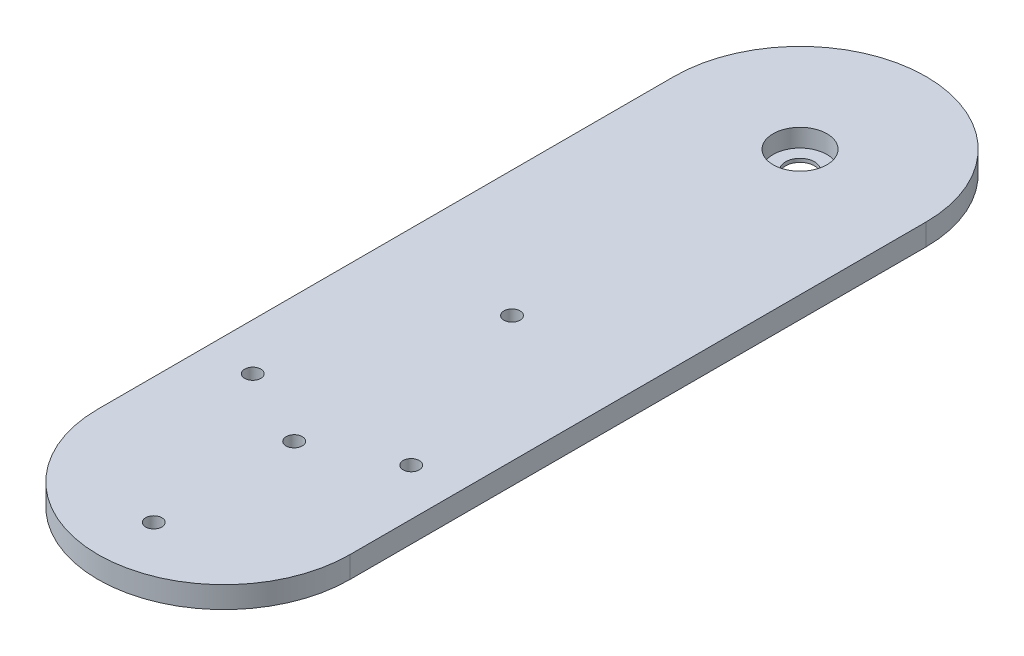
ISO-10303-21;
HEADER;
FILE_DESCRIPTION(('STEP AP214'),'2;1');
FILE_NAME('part.step','',(''),(''),'','','');
FILE_SCHEMA(('AUTOMOTIVE_DESIGN { 1 0 10303 214 1 1 1 1 }'));
ENDSEC;
DATA;
#1=APPLICATION_CONTEXT('core data for automotive mechanical design processes');
#2=APPLICATION_PROTOCOL_DEFINITION('international standard','automotive_design',2000,#1);
#3=PRODUCT_CONTEXT('',#1,'mechanical');
#4=PRODUCT('Part','Part','',(#3));
#5=PRODUCT_RELATED_PRODUCT_CATEGORY('part','',(#4));
#6=PRODUCT_DEFINITION_FORMATION('','',#4);
#7=PRODUCT_DEFINITION_CONTEXT('part definition',#1,'design');
#8=PRODUCT_DEFINITION('design','',#6,#7);
#9=PRODUCT_DEFINITION_SHAPE('','',#8);
#10=(LENGTH_UNIT() NAMED_UNIT(*) SI_UNIT(.MILLI.,.METRE.));
#11=(NAMED_UNIT(*) PLANE_ANGLE_UNIT() SI_UNIT($,.RADIAN.));
#12=(NAMED_UNIT(*) SI_UNIT($,.STERADIAN.) SOLID_ANGLE_UNIT());
#13=UNCERTAINTY_MEASURE_WITH_UNIT(LENGTH_MEASURE(1.E-05),#10,'distance_accuracy_value','');
#14=(GEOMETRIC_REPRESENTATION_CONTEXT(3) GLOBAL_UNCERTAINTY_ASSIGNED_CONTEXT((#13)) GLOBAL_UNIT_ASSIGNED_CONTEXT((#10,
#11,#12)) REPRESENTATION_CONTEXT('',''));
#15=CARTESIAN_POINT('',(0.,0.,0.));
#16=DIRECTION('',(0.,0.,1.));
#17=DIRECTION('',(1.,0.,0.));
#18=AXIS2_PLACEMENT_3D('',#15,#16,#17);
#19=CARTESIAN_POINT('',(35.,-46.75,330.));
#20=DIRECTION('',(-1.,0.,0.));
#21=DIRECTION('',(0.,0.,1.));
#22=AXIS2_PLACEMENT_3D('',#19,#20,#21);
#23=PLANE('',#22);
#24=DIRECTION('',(0.,0.,-1.));
#25=VECTOR('',#24,1.);
#26=CARTESIAN_POINT('',(35.,-52.75,330.));
#27=LINE('',#26,#25);
#28=CARTESIAN_POINT('',(35.,-52.75,330.));
#29=VERTEX_POINT('',#28);
#30=CARTESIAN_POINT('',(35.,-52.75,170.));
#31=VERTEX_POINT('',#30);
#32=EDGE_CURVE('E91',#29,#31,#27,.T.);
#33=ORIENTED_EDGE('',*,*,#32,.T.);
#34=DIRECTION('',(0.,-1.,0.));
#35=VECTOR('',#34,1.);
#36=CARTESIAN_POINT('',(35.,-46.75,170.));
#37=LINE('',#36,#35);
#38=CARTESIAN_POINT('',(35.,-46.75,170.));
#39=VERTEX_POINT('',#38);
#40=EDGE_CURVE('E11',#39,#31,#37,.T.);
#41=ORIENTED_EDGE('',*,*,#40,.F.);
#42=DIRECTION('',(0.,0.,-1.));
#43=VECTOR('',#42,1.);
#44=CARTESIAN_POINT('',(35.,-46.75,330.));
#45=LINE('',#44,#43);
#46=CARTESIAN_POINT('',(35.,-46.75,330.));
#47=VERTEX_POINT('',#46);
#48=EDGE_CURVE('E58',#47,#39,#45,.T.);
#49=ORIENTED_EDGE('',*,*,#48,.F.);
#50=DIRECTION('',(0.,-1.,0.));
#51=VECTOR('',#50,1.);
#52=CARTESIAN_POINT('',(35.,-46.75,330.));
#53=LINE('',#52,#51);
#54=EDGE_CURVE('E105',#47,#29,#53,.T.);
#55=ORIENTED_EDGE('',*,*,#54,.T.);
#56=EDGE_LOOP('',(#33,#41,#49,#55));
#57=FACE_BOUND('',#56,.T.);
#58=ADVANCED_FACE('F43',(#57),#23,.F.);
#59=CARTESIAN_POINT('',(-35.,-46.75,330.));
#60=DIRECTION('',(1.,0.,0.));
#61=DIRECTION('',(0.,0.,-1.));
#62=AXIS2_PLACEMENT_3D('',#59,#60,#61);
#63=PLANE('',#62);
#64=DIRECTION('',(0.,0.,1.));
#65=VECTOR('',#64,1.);
#66=CARTESIAN_POINT('',(-35.,-52.75,330.));
#67=LINE('',#66,#65);
#68=CARTESIAN_POINT('',(-35.,-52.75,170.));
#69=VERTEX_POINT('',#68);
#70=CARTESIAN_POINT('',(-35.,-52.75,330.));
#71=VERTEX_POINT('',#70);
#72=EDGE_CURVE('E83',#69,#71,#67,.T.);
#73=ORIENTED_EDGE('',*,*,#72,.T.);
#74=DIRECTION('',(0.,-1.,0.));
#75=VECTOR('',#74,1.);
#76=CARTESIAN_POINT('',(-35.,-46.75,330.));
#77=LINE('',#76,#75);
#78=CARTESIAN_POINT('',(-35.,-46.75,330.));
#79=VERTEX_POINT('',#78);
#80=EDGE_CURVE('E86',#79,#71,#77,.T.);
#81=ORIENTED_EDGE('',*,*,#80,.F.);
#82=DIRECTION('',(0.,0.,1.));
#83=VECTOR('',#82,1.);
#84=CARTESIAN_POINT('',(-35.,-46.75,330.));
#85=LINE('',#84,#83);
#86=CARTESIAN_POINT('',(-35.,-46.75,170.));
#87=VERTEX_POINT('',#86);
#88=EDGE_CURVE('E120',#87,#79,#85,.T.);
#89=ORIENTED_EDGE('',*,*,#88,.F.);
#90=DIRECTION('',(0.,-1.,0.));
#91=VECTOR('',#90,1.);
#92=CARTESIAN_POINT('',(-35.,-46.75,170.));
#93=LINE('',#92,#91);
#94=EDGE_CURVE('E55',#87,#69,#93,.T.);
#95=ORIENTED_EDGE('',*,*,#94,.T.);
#96=EDGE_LOOP('',(#73,#81,#89,#95));
#97=FACE_BOUND('',#96,.T.);
#98=ADVANCED_FACE('F88',(#97),#63,.F.);
#99=CARTESIAN_POINT('',(0.,-46.75,0.));
#100=DIRECTION('',(0.,-1.,0.));
#101=DIRECTION('',(0.,0.,-1.));
#102=AXIS2_PLACEMENT_3D('',#99,#100,#101);
#103=PLANE('',#102);
#104=CARTESIAN_POINT('',(0.,-46.75,310.5));
#105=DIRECTION('',(0.,1.,0.));
#106=DIRECTION('',(0.,0.,1.));
#107=AXIS2_PLACEMENT_3D('',#104,#105,#106);
#108=CIRCLE('',#107,2.25);
#109=CARTESIAN_POINT('',(0.,-46.75,312.75));
#110=VERTEX_POINT('',#109);
#111=EDGE_CURVE('E135',#110,#110,#108,.T.);
#112=ORIENTED_EDGE('',*,*,#111,.F.);
#113=EDGE_LOOP('',(#112));
#114=FACE_BOUND('',#113,.T.);
#115=CARTESIAN_POINT('',(0.,-46.75,349.5));
#116=DIRECTION('',(0.,1.,0.));
#117=DIRECTION('',(0.,0.,1.));
#118=AXIS2_PLACEMENT_3D('',#115,#116,#117);
#119=CIRCLE('',#118,2.25);
#120=CARTESIAN_POINT('',(0.,-46.75,351.75));
#121=VERTEX_POINT('',#120);
#122=EDGE_CURVE('E248',#121,#121,#119,.T.);
#123=ORIENTED_EDGE('',*,*,#122,.F.);
#124=EDGE_LOOP('',(#123));
#125=FACE_BOUND('',#124,.T.);
#126=CARTESIAN_POINT('',(0.,-46.75,170.));
#127=DIRECTION('',(0.,1.,0.));
#128=DIRECTION('',(0.,0.,1.));
#129=AXIS2_PLACEMENT_3D('',#126,#127,#128);
#130=CIRCLE('',#129,7.475);
#131=CARTESIAN_POINT('',(0.,-46.75,177.475));
#132=VERTEX_POINT('',#131);
#133=EDGE_CURVE('E141',#132,#132,#130,.T.);
#134=ORIENTED_EDGE('',*,*,#133,.F.);
#135=EDGE_LOOP('',(#134));
#136=FACE_BOUND('',#135,.T.);
#137=CARTESIAN_POINT('',(0.,-46.75,250.));
#138=DIRECTION('',(0.,1.,0.));
#139=DIRECTION('',(0.,0.,1.));
#140=AXIS2_PLACEMENT_3D('',#137,#138,#139);
#141=CIRCLE('',#140,2.25);
#142=CARTESIAN_POINT('',(0.,-46.75,252.25));
#143=VERTEX_POINT('',#142);
#144=EDGE_CURVE('E111',#143,#143,#141,.T.);
#145=ORIENTED_EDGE('',*,*,#144,.F.);
#146=EDGE_LOOP('',(#145));
#147=FACE_BOUND('',#146,.T.);
#148=CARTESIAN_POINT('',(-22.,-46.75,300.));
#149=DIRECTION('',(0.,1.,0.));
#150=DIRECTION('',(0.,0.,1.));
#151=AXIS2_PLACEMENT_3D('',#148,#149,#150);
#152=CIRCLE('',#151,2.25);
#153=CARTESIAN_POINT('',(-22.,-46.75,302.25));
#154=VERTEX_POINT('',#153);
#155=EDGE_CURVE('E166',#154,#154,#152,.T.);
#156=ORIENTED_EDGE('',*,*,#155,.F.);
#157=EDGE_LOOP('',(#156));
#158=FACE_BOUND('',#157,.T.);
#159=CARTESIAN_POINT('',(22.,-46.75,300.));
#160=DIRECTION('',(0.,1.,0.));
#161=DIRECTION('',(0.,0.,1.));
#162=AXIS2_PLACEMENT_3D('',#159,#160,#161);
#163=CIRCLE('',#162,2.25);
#164=CARTESIAN_POINT('',(22.,-46.75,302.25));
#165=VERTEX_POINT('',#164);
#166=EDGE_CURVE('E138',#165,#165,#163,.T.);
#167=ORIENTED_EDGE('',*,*,#166,.F.);
#168=EDGE_LOOP('',(#167));
#169=FACE_BOUND('',#168,.T.);
#170=ORIENTED_EDGE('',*,*,#48,.T.);
#171=CARTESIAN_POINT('',(0.,-46.75,170.));
#172=DIRECTION('',(0.,1.,0.));
#173=DIRECTION('',(0.,0.,1.));
#174=AXIS2_PLACEMENT_3D('',#171,#172,#173);
#175=CIRCLE('',#174,35.);
#176=EDGE_CURVE('E115',#39,#87,#175,.T.);
#177=ORIENTED_EDGE('',*,*,#176,.T.);
#178=ORIENTED_EDGE('',*,*,#88,.T.);
#179=CARTESIAN_POINT('',(0.,-46.75,330.));
#180=DIRECTION('',(0.,1.,0.));
#181=DIRECTION('',(0.,0.,1.));
#182=AXIS2_PLACEMENT_3D('',#179,#180,#181);
#183=CIRCLE('',#182,35.);
#184=EDGE_CURVE('E99',#79,#47,#183,.T.);
#185=ORIENTED_EDGE('',*,*,#184,.T.);
#186=EDGE_LOOP('',(#170,#177,#178,#185));
#187=FACE_BOUND('',#186,.T.);
#188=ADVANCED_FACE('F180',(#114,#125,#136,#147,#158,#169,#187),#103,.F.);
#189=CARTESIAN_POINT('',(0.,-52.75,0.));
#190=DIRECTION('',(0.,-1.,0.));
#191=DIRECTION('',(0.,0.,-1.));
#192=AXIS2_PLACEMENT_3D('',#189,#190,#191);
#193=PLANE('',#192);
#194=CARTESIAN_POINT('',(0.,-52.75,310.5));
#195=DIRECTION('',(0.,1.,0.));
#196=DIRECTION('',(0.,0.,1.));
#197=AXIS2_PLACEMENT_3D('',#194,#195,#196);
#198=CIRCLE('',#197,2.25);
#199=CARTESIAN_POINT('',(0.,-52.75,312.75));
#200=VERTEX_POINT('',#199);
#201=EDGE_CURVE('E136',#200,#200,#198,.T.);
#202=ORIENTED_EDGE('',*,*,#201,.T.);
#203=EDGE_LOOP('',(#202));
#204=FACE_BOUND('',#203,.T.);
#205=CARTESIAN_POINT('',(0.,-52.75,349.5));
#206=DIRECTION('',(0.,1.,0.));
#207=DIRECTION('',(0.,0.,1.));
#208=AXIS2_PLACEMENT_3D('',#205,#206,#207);
#209=CIRCLE('',#208,2.25);
#210=CARTESIAN_POINT('',(0.,-52.75,351.75));
#211=VERTEX_POINT('',#210);
#212=EDGE_CURVE('E155',#211,#211,#209,.T.);
#213=ORIENTED_EDGE('',*,*,#212,.T.);
#214=EDGE_LOOP('',(#213));
#215=FACE_BOUND('',#214,.T.);
#216=CARTESIAN_POINT('',(0.,-52.75,170.));
#217=DIRECTION('',(0.,1.,0.));
#218=DIRECTION('',(0.,0.,1.));
#219=AXIS2_PLACEMENT_3D('',#216,#217,#218);
#220=CIRCLE('',#219,4.);
#221=CARTESIAN_POINT('',(0.,-52.75,174.));
#222=VERTEX_POINT('',#221);
#223=EDGE_CURVE('E134',#222,#222,#220,.T.);
#224=ORIENTED_EDGE('',*,*,#223,.T.);
#225=EDGE_LOOP('',(#224));
#226=FACE_BOUND('',#225,.T.);
#227=CARTESIAN_POINT('',(0.,-52.75,250.));
#228=DIRECTION('',(0.,1.,0.));
#229=DIRECTION('',(0.,0.,1.));
#230=AXIS2_PLACEMENT_3D('',#227,#228,#229);
#231=CIRCLE('',#230,2.25);
#232=CARTESIAN_POINT('',(0.,-52.75,252.25));
#233=VERTEX_POINT('',#232);
#234=EDGE_CURVE('E144',#233,#233,#231,.T.);
#235=ORIENTED_EDGE('',*,*,#234,.T.);
#236=EDGE_LOOP('',(#235));
#237=FACE_BOUND('',#236,.T.);
#238=CARTESIAN_POINT('',(-22.,-52.75,300.));
#239=DIRECTION('',(0.,1.,0.));
#240=DIRECTION('',(0.,0.,1.));
#241=AXIS2_PLACEMENT_3D('',#238,#239,#240);
#242=CIRCLE('',#241,2.25);
#243=CARTESIAN_POINT('',(-22.,-52.75,302.25));
#244=VERTEX_POINT('',#243);
#245=EDGE_CURVE('E146',#244,#244,#242,.T.);
#246=ORIENTED_EDGE('',*,*,#245,.T.);
#247=EDGE_LOOP('',(#246));
#248=FACE_BOUND('',#247,.T.);
#249=CARTESIAN_POINT('',(22.,-52.75,300.));
#250=DIRECTION('',(0.,1.,0.));
#251=DIRECTION('',(0.,0.,1.));
#252=AXIS2_PLACEMENT_3D('',#249,#250,#251);
#253=CIRCLE('',#252,2.25);
#254=CARTESIAN_POINT('',(22.,-52.75,302.25));
#255=VERTEX_POINT('',#254);
#256=EDGE_CURVE('E142',#255,#255,#253,.T.);
#257=ORIENTED_EDGE('',*,*,#256,.T.);
#258=EDGE_LOOP('',(#257));
#259=FACE_BOUND('',#258,.T.);
#260=ORIENTED_EDGE('',*,*,#72,.F.);
#261=CARTESIAN_POINT('',(0.,-52.75,170.));
#262=DIRECTION('',(0.,1.,0.));
#263=DIRECTION('',(0.,0.,1.));
#264=AXIS2_PLACEMENT_3D('',#261,#262,#263);
#265=CIRCLE('',#264,35.);
#266=EDGE_CURVE('E72',#31,#69,#265,.T.);
#267=ORIENTED_EDGE('',*,*,#266,.F.);
#268=ORIENTED_EDGE('',*,*,#32,.F.);
#269=CARTESIAN_POINT('',(0.,-52.75,330.));
#270=DIRECTION('',(0.,1.,0.));
#271=DIRECTION('',(0.,0.,1.));
#272=AXIS2_PLACEMENT_3D('',#269,#270,#271);
#273=CIRCLE('',#272,35.);
#274=EDGE_CURVE('E98',#71,#29,#273,.T.);
#275=ORIENTED_EDGE('',*,*,#274,.F.);
#276=EDGE_LOOP('',(#260,#267,#268,#275));
#277=FACE_BOUND('',#276,.T.);
#278=ADVANCED_FACE('F104',(#204,#215,#226,#237,#248,#259,#277),#193,.T.);
#279=CARTESIAN_POINT('',(0.,-46.75,330.));
#280=DIRECTION('',(0.,-1.,0.));
#281=DIRECTION('',(0.,0.,-1.));
#282=AXIS2_PLACEMENT_3D('',#279,#280,#281);
#283=CYLINDRICAL_SURFACE('',#282,35.);
#284=ORIENTED_EDGE('',*,*,#274,.T.);
#285=ORIENTED_EDGE('',*,*,#54,.F.);
#286=ORIENTED_EDGE('',*,*,#184,.F.);
#287=ORIENTED_EDGE('',*,*,#80,.T.);
#288=EDGE_LOOP('',(#284,#285,#286,#287));
#289=FACE_BOUND('',#288,.T.);
#290=ADVANCED_FACE('F100',(#289),#283,.T.);
#291=CARTESIAN_POINT('',(0.,-46.75,170.));
#292=DIRECTION('',(0.,-1.,0.));
#293=DIRECTION('',(0.,0.,-1.));
#294=AXIS2_PLACEMENT_3D('',#291,#292,#293);
#295=CYLINDRICAL_SURFACE('',#294,35.);
#296=ORIENTED_EDGE('',*,*,#176,.F.);
#297=ORIENTED_EDGE('',*,*,#40,.T.);
#298=ORIENTED_EDGE('',*,*,#266,.T.);
#299=ORIENTED_EDGE('',*,*,#94,.F.);
#300=EDGE_LOOP('',(#296,#297,#298,#299));
#301=FACE_BOUND('',#300,.T.);
#302=ADVANCED_FACE('F177',(#301),#295,.T.);
#303=CARTESIAN_POINT('',(22.,-46.75,300.));
#304=DIRECTION('',(0.,-1.,0.));
#305=DIRECTION('',(0.,0.,-1.));
#306=AXIS2_PLACEMENT_3D('',#303,#304,#305);
#307=CYLINDRICAL_SURFACE('',#306,2.25);
#308=ORIENTED_EDGE('',*,*,#166,.T.);
#309=EDGE_LOOP('',(#308));
#310=FACE_BOUND('',#309,.T.);
#311=ORIENTED_EDGE('',*,*,#256,.F.);
#312=EDGE_LOOP('',(#311));
#313=FACE_BOUND('',#312,.T.);
#314=ADVANCED_FACE('F179',(#310,#313),#307,.F.);
#315=CARTESIAN_POINT('',(-22.,-46.75,300.));
#316=DIRECTION('',(0.,-1.,0.));
#317=DIRECTION('',(0.,0.,-1.));
#318=AXIS2_PLACEMENT_3D('',#315,#316,#317);
#319=CYLINDRICAL_SURFACE('',#318,2.25);
#320=ORIENTED_EDGE('',*,*,#155,.T.);
#321=EDGE_LOOP('',(#320));
#322=FACE_BOUND('',#321,.T.);
#323=ORIENTED_EDGE('',*,*,#245,.F.);
#324=EDGE_LOOP('',(#323));
#325=FACE_BOUND('',#324,.T.);
#326=ADVANCED_FACE('F183',(#322,#325),#319,.F.);
#327=CARTESIAN_POINT('',(0.,-46.75,250.));
#328=DIRECTION('',(0.,-1.,0.));
#329=DIRECTION('',(0.,0.,-1.));
#330=AXIS2_PLACEMENT_3D('',#327,#328,#329);
#331=CYLINDRICAL_SURFACE('',#330,2.25);
#332=ORIENTED_EDGE('',*,*,#144,.T.);
#333=EDGE_LOOP('',(#332));
#334=FACE_BOUND('',#333,.T.);
#335=ORIENTED_EDGE('',*,*,#234,.F.);
#336=EDGE_LOOP('',(#335));
#337=FACE_BOUND('',#336,.T.);
#338=ADVANCED_FACE('F216',(#334,#337),#331,.F.);
#339=CARTESIAN_POINT('',(0.,-46.75,170.));
#340=DIRECTION('',(0.,-1.,0.));
#341=DIRECTION('',(0.,0.,-1.));
#342=AXIS2_PLACEMENT_3D('',#339,#340,#341);
#343=CYLINDRICAL_SURFACE('',#342,7.475);
#344=ORIENTED_EDGE('',*,*,#133,.T.);
#345=EDGE_LOOP('',(#344));
#346=FACE_BOUND('',#345,.T.);
#347=CARTESIAN_POINT('',(0.,-51.75,170.));
#348=DIRECTION('',(0.,1.,0.));
#349=DIRECTION('',(0.,0.,1.));
#350=AXIS2_PLACEMENT_3D('',#347,#348,#349);
#351=CIRCLE('',#350,7.475);
#352=CARTESIAN_POINT('',(0.,-51.75,177.475));
#353=VERTEX_POINT('',#352);
#354=EDGE_CURVE('E133',#353,#353,#351,.T.);
#355=ORIENTED_EDGE('',*,*,#354,.F.);
#356=EDGE_LOOP('',(#355));
#357=FACE_BOUND('',#356,.T.);
#358=ADVANCED_FACE('F222',(#346,#357),#343,.F.);
#359=CARTESIAN_POINT('',(0.,-51.75,170.));
#360=DIRECTION('',(0.,1.,0.));
#361=DIRECTION('',(0.,0.,1.));
#362=AXIS2_PLACEMENT_3D('',#359,#360,#361);
#363=PLANE('',#362);
#364=CARTESIAN_POINT('',(0.,-51.75,170.));
#365=DIRECTION('',(0.,1.,0.));
#366=DIRECTION('',(0.,0.,1.));
#367=AXIS2_PLACEMENT_3D('',#364,#365,#366);
#368=CIRCLE('',#367,4.);
#369=CARTESIAN_POINT('',(0.,-51.75,174.));
#370=VERTEX_POINT('',#369);
#371=EDGE_CURVE('E126',#370,#370,#368,.T.);
#372=ORIENTED_EDGE('',*,*,#371,.F.);
#373=EDGE_LOOP('',(#372));
#374=FACE_BOUND('',#373,.T.);
#375=ORIENTED_EDGE('',*,*,#354,.T.);
#376=EDGE_LOOP('',(#375));
#377=FACE_BOUND('',#376,.T.);
#378=ADVANCED_FACE('F229',(#374,#377),#363,.T.);
#379=CARTESIAN_POINT('',(0.,-51.75,170.));
#380=DIRECTION('',(0.,-1.,0.));
#381=DIRECTION('',(0.,0.,-1.));
#382=AXIS2_PLACEMENT_3D('',#379,#380,#381);
#383=CYLINDRICAL_SURFACE('',#382,4.);
#384=ORIENTED_EDGE('',*,*,#371,.T.);
#385=EDGE_LOOP('',(#384));
#386=FACE_BOUND('',#385,.T.);
#387=ORIENTED_EDGE('',*,*,#223,.F.);
#388=EDGE_LOOP('',(#387));
#389=FACE_BOUND('',#388,.T.);
#390=ADVANCED_FACE('F226',(#386,#389),#383,.F.);
#391=CARTESIAN_POINT('',(0.,-46.75,349.5));
#392=DIRECTION('',(0.,-1.,0.));
#393=DIRECTION('',(0.,0.,-1.));
#394=AXIS2_PLACEMENT_3D('',#391,#392,#393);
#395=CYLINDRICAL_SURFACE('',#394,2.25);
#396=ORIENTED_EDGE('',*,*,#122,.T.);
#397=EDGE_LOOP('',(#396));
#398=FACE_BOUND('',#397,.T.);
#399=ORIENTED_EDGE('',*,*,#212,.F.);
#400=EDGE_LOOP('',(#399));
#401=FACE_BOUND('',#400,.T.);
#402=ADVANCED_FACE('F233',(#398,#401),#395,.F.);
#403=CARTESIAN_POINT('',(0.,-46.75,310.5));
#404=DIRECTION('',(0.,-1.,0.));
#405=DIRECTION('',(0.,0.,-1.));
#406=AXIS2_PLACEMENT_3D('',#403,#404,#405);
#407=CYLINDRICAL_SURFACE('',#406,2.25);
#408=ORIENTED_EDGE('',*,*,#111,.T.);
#409=EDGE_LOOP('',(#408));
#410=FACE_BOUND('',#409,.T.);
#411=ORIENTED_EDGE('',*,*,#201,.F.);
#412=EDGE_LOOP('',(#411));
#413=FACE_BOUND('',#412,.T.);
#414=ADVANCED_FACE('F236',(#410,#413),#407,.F.);
#415=CLOSED_SHELL('',(#58,#98,#188,#278,#290,#302,#314,#326,#338,#358,#378,#390,#402,#414));
#416=MANIFOLD_SOLID_BREP('B2',#415);
#417=ADVANCED_BREP_SHAPE_REPRESENTATION('',(#18,#416),#14);
#418=SHAPE_DEFINITION_REPRESENTATION(#9,#417);
ENDSEC;
END-ISO-10303-21;
